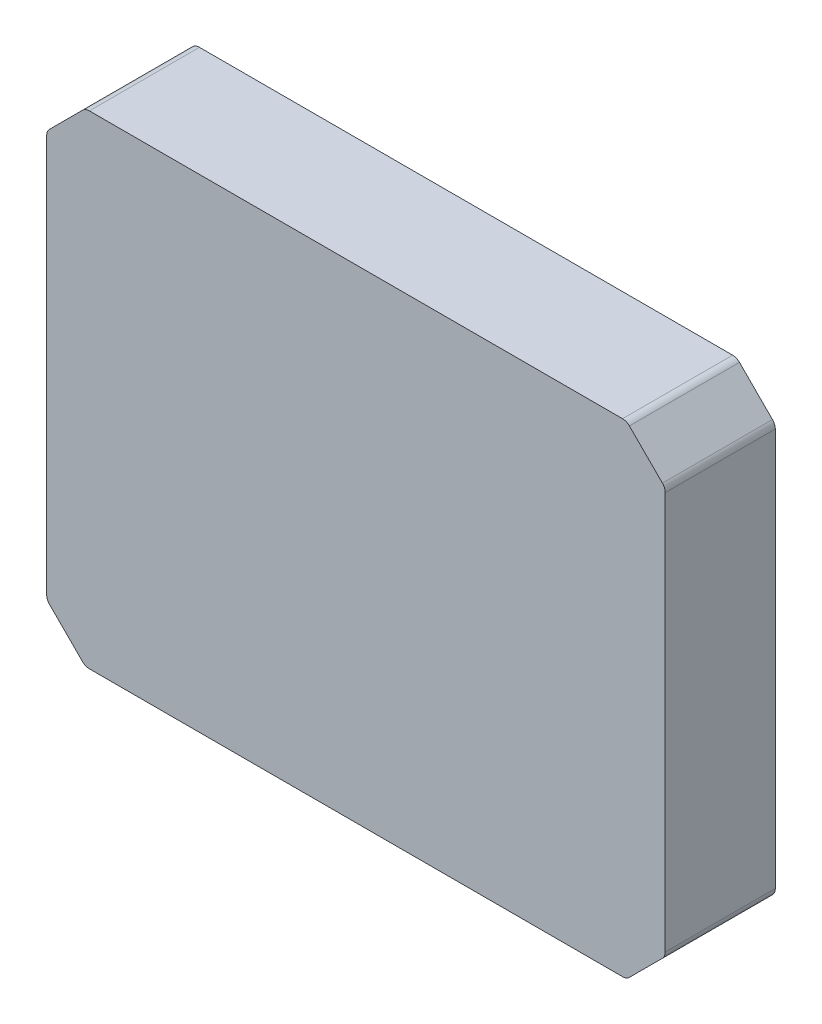
ISO-10303-21;
HEADER;
FILE_DESCRIPTION(('STEP AP214'),'2;1');
FILE_NAME('part.step','',(''),(''),'','','');
FILE_SCHEMA(('AUTOMOTIVE_DESIGN { 1 0 10303 214 1 1 1 1 }'));
ENDSEC;
DATA;
#1=APPLICATION_CONTEXT('core data for automotive mechanical design processes');
#2=APPLICATION_PROTOCOL_DEFINITION('international standard','automotive_design',2000,#1);
#3=PRODUCT_CONTEXT('',#1,'mechanical');
#4=PRODUCT('Part','Part','',(#3));
#5=PRODUCT_RELATED_PRODUCT_CATEGORY('part','',(#4));
#6=PRODUCT_DEFINITION_FORMATION('','',#4);
#7=PRODUCT_DEFINITION_CONTEXT('part definition',#1,'design');
#8=PRODUCT_DEFINITION('design','',#6,#7);
#9=PRODUCT_DEFINITION_SHAPE('','',#8);
#10=(LENGTH_UNIT() NAMED_UNIT(*) SI_UNIT(.MILLI.,.METRE.));
#11=(NAMED_UNIT(*) PLANE_ANGLE_UNIT() SI_UNIT($,.RADIAN.));
#12=(NAMED_UNIT(*) SI_UNIT($,.STERADIAN.) SOLID_ANGLE_UNIT());
#13=UNCERTAINTY_MEASURE_WITH_UNIT(LENGTH_MEASURE(1.E-05),#10,'distance_accuracy_value','');
#14=(GEOMETRIC_REPRESENTATION_CONTEXT(3) GLOBAL_UNCERTAINTY_ASSIGNED_CONTEXT((#13)) GLOBAL_UNIT_ASSIGNED_CONTEXT((#10,
#11,#12)) REPRESENTATION_CONTEXT('',''));
#15=CARTESIAN_POINT('',(0.,0.,0.));
#16=DIRECTION('',(0.,0.,1.));
#17=DIRECTION('',(1.,0.,0.));
#18=AXIS2_PLACEMENT_3D('',#15,#16,#17);
#19=CARTESIAN_POINT('',(1.55,1.029289321881,0.));
#20=DIRECTION('',(0.,0.,-1.));
#21=DIRECTION('',(0.923879532511277,0.382683432365114,0.));
#22=AXIS2_PLACEMENT_3D('',#19,#20,#21);
#23=CYLINDRICAL_SURFACE('',#22,0.05);
#24=CARTESIAN_POINT('',(1.55,1.029289321881,0.002));
#25=DIRECTION('',(0.,0.,1.));
#26=DIRECTION('',(0.923879532511277,0.382683432365114,0.));
#27=AXIS2_PLACEMENT_3D('',#24,#25,#26);
#28=CIRCLE('',#27,0.05);
#29=CARTESIAN_POINT('',(1.6,1.029289321881,0.002));
#30=VERTEX_POINT('',#29);
#31=CARTESIAN_POINT('',(1.585355339059,1.064644660941,0.002));
#32=VERTEX_POINT('',#31);
#33=EDGE_CURVE('E201',#30,#32,#28,.T.);
#34=ORIENTED_EDGE('',*,*,#33,.T.);
#35=DIRECTION('',(0.,0.,1.));
#36=VECTOR('',#35,1.);
#37=CARTESIAN_POINT('',(1.585355339059,1.064644660941,0.));
#38=LINE('',#37,#36);
#39=CARTESIAN_POINT('',(1.585355339059,1.064644660941,0.5715));
#40=VERTEX_POINT('',#39);
#41=EDGE_CURVE('E298',#32,#40,#38,.T.);
#42=ORIENTED_EDGE('',*,*,#41,.T.);
#43=CARTESIAN_POINT('',(1.55,1.029289321881,0.5715));
#44=DIRECTION('',(0.,0.,-1.));
#45=DIRECTION('',(-1.,0.,0.));
#46=AXIS2_PLACEMENT_3D('',#43,#44,#45);
#47=CIRCLE('',#46,0.05);
#48=CARTESIAN_POINT('',(1.6,1.029289321881,0.5715));
#49=VERTEX_POINT('',#48);
#50=EDGE_CURVE('E200',#40,#49,#47,.T.);
#51=ORIENTED_EDGE('',*,*,#50,.T.);
#52=DIRECTION('',(0.,0.,-1.));
#53=VECTOR('',#52,1.);
#54=CARTESIAN_POINT('',(1.6,1.029289321881,0.));
#55=LINE('',#54,#53);
#56=EDGE_CURVE('E175',#49,#30,#55,.T.);
#57=ORIENTED_EDGE('',*,*,#56,.T.);
#58=EDGE_LOOP('',(#34,#42,#51,#57));
#59=FACE_BOUND('',#58,.T.);
#60=ADVANCED_FACE('F17',(#59),#23,.T.);
#61=CARTESIAN_POINT('',(1.5,-1.15,0.));
#62=DIRECTION('',(0.707106781186548,-0.707106781186548,0.));
#63=DIRECTION('',(0.,0.,-1.));
#64=AXIS2_PLACEMENT_3D('',#61,#62,#63);
#65=PLANE('',#64);
#66=DIRECTION('',(0.707106781186548,0.707106781186548,0.));
#67=VECTOR('',#66,1.);
#68=CARTESIAN_POINT('',(1.4125,-1.2375,0.002));
#69=LINE('',#68,#67);
#70=CARTESIAN_POINT('',(1.414644660941,-1.235355339059,0.002));
#71=VERTEX_POINT('',#70);
#72=CARTESIAN_POINT('',(1.585355339059,-1.064644660941,0.002));
#73=VERTEX_POINT('',#72);
#74=EDGE_CURVE('E170',#71,#73,#69,.T.);
#75=ORIENTED_EDGE('',*,*,#74,.T.);
#76=DIRECTION('',(0.,0.,-1.));
#77=VECTOR('',#76,1.);
#78=CARTESIAN_POINT('',(1.585355339059,-1.064644660941,0.));
#79=LINE('',#78,#77);
#80=CARTESIAN_POINT('',(1.585355339059,-1.064644660941,0.5715));
#81=VERTEX_POINT('',#80);
#82=EDGE_CURVE('E164',#81,#73,#79,.T.);
#83=ORIENTED_EDGE('',*,*,#82,.F.);
#84=DIRECTION('',(-0.707106781186548,-0.707106781186548,0.));
#85=VECTOR('',#84,1.);
#86=CARTESIAN_POINT('',(1.36982233047,-1.28017766953,0.5715));
#87=LINE('',#86,#85);
#88=CARTESIAN_POINT('',(1.414644660941,-1.235355339059,0.5715));
#89=VERTEX_POINT('',#88);
#90=EDGE_CURVE('E168',#81,#89,#87,.T.);
#91=ORIENTED_EDGE('',*,*,#90,.T.);
#92=DIRECTION('',(0.,0.,1.));
#93=VECTOR('',#92,1.);
#94=CARTESIAN_POINT('',(1.414644660941,-1.235355339059,0.));
#95=LINE('',#94,#93);
#96=EDGE_CURVE('E11',#71,#89,#95,.T.);
#97=ORIENTED_EDGE('',*,*,#96,.F.);
#98=EDGE_LOOP('',(#75,#83,#91,#97));
#99=FACE_BOUND('',#98,.T.);
#100=ADVANCED_FACE('F166',(#99),#65,.T.);
#101=CARTESIAN_POINT('',(1.379289321881,-1.2,0.));
#102=DIRECTION('',(0.,0.,-1.));
#103=DIRECTION('',(0.382683432365114,-0.923879532511277,0.));
#104=AXIS2_PLACEMENT_3D('',#101,#102,#103);
#105=CYLINDRICAL_SURFACE('',#104,0.05);
#106=CARTESIAN_POINT('',(1.379289321881,-1.2,0.002));
#107=DIRECTION('',(0.,0.,1.));
#108=DIRECTION('',(0.382683432365114,-0.923879532511277,0.));
#109=AXIS2_PLACEMENT_3D('',#106,#107,#108);
#110=CIRCLE('',#109,0.05);
#111=CARTESIAN_POINT('',(1.379289321881,-1.25,0.002));
#112=VERTEX_POINT('',#111);
#113=EDGE_CURVE('E332',#112,#71,#110,.T.);
#114=ORIENTED_EDGE('',*,*,#113,.T.);
#115=ORIENTED_EDGE('',*,*,#96,.T.);
#116=CARTESIAN_POINT('',(1.379289321881,-1.2,0.5715));
#117=DIRECTION('',(0.,0.,-1.));
#118=DIRECTION('',(0.,1.,0.));
#119=AXIS2_PLACEMENT_3D('',#116,#117,#118);
#120=CIRCLE('',#119,0.05);
#121=CARTESIAN_POINT('',(1.379289321881,-1.25,0.5715));
#122=VERTEX_POINT('',#121);
#123=EDGE_CURVE('E191',#89,#122,#120,.T.);
#124=ORIENTED_EDGE('',*,*,#123,.T.);
#125=DIRECTION('',(0.,0.,-1.));
#126=VECTOR('',#125,1.);
#127=CARTESIAN_POINT('',(1.379289321881,-1.25,0.));
#128=LINE('',#127,#126);
#129=EDGE_CURVE('E235',#122,#112,#128,.T.);
#130=ORIENTED_EDGE('',*,*,#129,.T.);
#131=EDGE_LOOP('',(#114,#115,#124,#130));
#132=FACE_BOUND('',#131,.T.);
#133=ADVANCED_FACE('F387',(#132),#105,.T.);
#134=CARTESIAN_POINT('',(-1.5,-1.15,0.));
#135=DIRECTION('',(-0.707106781186548,-0.707106781186548,0.));
#136=DIRECTION('',(-0.707106781186548,0.707106781186548,0.));
#137=AXIS2_PLACEMENT_3D('',#134,#135,#136);
#138=PLANE('',#137);
#139=DIRECTION('',(0.707106781186548,-0.707106781186548,0.));
#140=VECTOR('',#139,1.);
#141=CARTESIAN_POINT('',(-1.4125,-1.2375,0.002));
#142=LINE('',#141,#140);
#143=CARTESIAN_POINT('',(-1.585355339059,-1.064644660941,0.002));
#144=VERTEX_POINT('',#143);
#145=CARTESIAN_POINT('',(-1.414644660941,-1.235355339059,0.002));
#146=VERTEX_POINT('',#145);
#147=EDGE_CURVE('E335',#144,#146,#142,.T.);
#148=ORIENTED_EDGE('',*,*,#147,.T.);
#149=DIRECTION('',(0.,0.,-1.));
#150=VECTOR('',#149,1.);
#151=CARTESIAN_POINT('',(-1.414644660941,-1.235355339059,0.));
#152=LINE('',#151,#150);
#153=CARTESIAN_POINT('',(-1.414644660941,-1.235355339059,0.5715));
#154=VERTEX_POINT('',#153);
#155=EDGE_CURVE('E318',#154,#146,#152,.T.);
#156=ORIENTED_EDGE('',*,*,#155,.F.);
#157=DIRECTION('',(-0.707106781186548,0.707106781186548,0.));
#158=VECTOR('',#157,1.);
#159=CARTESIAN_POINT('',(-1.45517766953,-1.19482233047,0.5715));
#160=LINE('',#159,#158);
#161=CARTESIAN_POINT('',(-1.585355339059,-1.064644660941,0.5715));
#162=VERTEX_POINT('',#161);
#163=EDGE_CURVE('E234',#154,#162,#160,.T.);
#164=ORIENTED_EDGE('',*,*,#163,.T.);
#165=DIRECTION('',(0.,0.,1.));
#166=VECTOR('',#165,1.);
#167=CARTESIAN_POINT('',(-1.585355339059,-1.064644660941,0.4715));
#168=LINE('',#167,#166);
#169=EDGE_CURVE('E37',#144,#162,#168,.T.);
#170=ORIENTED_EDGE('',*,*,#169,.F.);
#171=EDGE_LOOP('',(#148,#156,#164,#170));
#172=FACE_BOUND('',#171,.T.);
#173=ADVANCED_FACE('F378',(#172),#138,.T.);
#174=CARTESIAN_POINT('',(-1.379289321881,1.2,0.));
#175=DIRECTION('',(0.,0.,-1.));
#176=DIRECTION('',(-0.382683432365114,0.923879532511277,0.));
#177=AXIS2_PLACEMENT_3D('',#174,#175,#176);
#178=CYLINDRICAL_SURFACE('',#177,0.05);
#179=CARTESIAN_POINT('',(-1.379289321881,1.2,0.002));
#180=DIRECTION('',(0.,0.,1.));
#181=DIRECTION('',(-0.382683432365114,0.923879532511277,0.));
#182=AXIS2_PLACEMENT_3D('',#179,#180,#181);
#183=CIRCLE('',#182,0.05);
#184=CARTESIAN_POINT('',(-1.379289321881,1.25,0.002));
#185=VERTEX_POINT('',#184);
#186=CARTESIAN_POINT('',(-1.414644660941,1.235355339059,0.002));
#187=VERTEX_POINT('',#186);
#188=EDGE_CURVE('E205',#185,#187,#183,.T.);
#189=ORIENTED_EDGE('',*,*,#188,.T.);
#190=DIRECTION('',(0.,0.,1.));
#191=VECTOR('',#190,1.);
#192=CARTESIAN_POINT('',(-1.414644660941,1.235355339059,0.4715));
#193=LINE('',#192,#191);
#194=CARTESIAN_POINT('',(-1.414644660941,1.235355339059,0.5715));
#195=VERTEX_POINT('',#194);
#196=EDGE_CURVE('E25',#187,#195,#193,.T.);
#197=ORIENTED_EDGE('',*,*,#196,.T.);
#198=CARTESIAN_POINT('',(-1.379289321881,1.2,0.5715));
#199=DIRECTION('',(0.,0.,-1.));
#200=DIRECTION('',(0.,-1.,0.));
#201=AXIS2_PLACEMENT_3D('',#198,#199,#200);
#202=CIRCLE('',#201,0.05);
#203=CARTESIAN_POINT('',(-1.379289321881,1.25,0.5715));
#204=VERTEX_POINT('',#203);
#205=EDGE_CURVE('E221',#195,#204,#202,.T.);
#206=ORIENTED_EDGE('',*,*,#205,.T.);
#207=DIRECTION('',(0.,0.,-1.));
#208=VECTOR('',#207,1.);
#209=CARTESIAN_POINT('',(-1.379289321881,1.25,0.));
#210=LINE('',#209,#208);
#211=EDGE_CURVE('E307',#204,#185,#210,.T.);
#212=ORIENTED_EDGE('',*,*,#211,.T.);
#213=EDGE_LOOP('',(#189,#197,#206,#212));
#214=FACE_BOUND('',#213,.T.);
#215=ADVANCED_FACE('F350',(#214),#178,.T.);
#216=CARTESIAN_POINT('',(-1.5,1.15,0.));
#217=DIRECTION('',(-0.707106781186548,0.707106781186548,0.));
#218=DIRECTION('',(0.,0.,1.));
#219=AXIS2_PLACEMENT_3D('',#216,#217,#218);
#220=PLANE('',#219);
#221=DIRECTION('',(-0.707106781186548,-0.707106781186548,0.));
#222=VECTOR('',#221,1.);
#223=CARTESIAN_POINT('',(-1.4125,1.2375,0.002));
#224=LINE('',#223,#222);
#225=CARTESIAN_POINT('',(-1.585355339059,1.064644660941,0.002));
#226=VERTEX_POINT('',#225);
#227=EDGE_CURVE('E239',#187,#226,#224,.T.);
#228=ORIENTED_EDGE('',*,*,#227,.T.);
#229=DIRECTION('',(0.,0.,-1.));
#230=VECTOR('',#229,1.);
#231=CARTESIAN_POINT('',(-1.585355339059,1.064644660941,0.));
#232=LINE('',#231,#230);
#233=CARTESIAN_POINT('',(-1.585355339059,1.064644660941,0.5715));
#234=VERTEX_POINT('',#233);
#235=EDGE_CURVE('E278',#234,#226,#232,.T.);
#236=ORIENTED_EDGE('',*,*,#235,.F.);
#237=DIRECTION('',(0.707106781186548,0.707106781186548,0.));
#238=VECTOR('',#237,1.);
#239=CARTESIAN_POINT('',(-1.36982233047,1.28017766953,0.5715));
#240=LINE('',#239,#238);
#241=EDGE_CURVE('E244',#234,#195,#240,.T.);
#242=ORIENTED_EDGE('',*,*,#241,.T.);
#243=ORIENTED_EDGE('',*,*,#196,.F.);
#244=EDGE_LOOP('',(#228,#236,#242,#243));
#245=FACE_BOUND('',#244,.T.);
#246=ADVANCED_FACE('F356',(#245),#220,.T.);
#247=CARTESIAN_POINT('',(-1.55,-1.029289321881,0.));
#248=DIRECTION('',(0.,0.,-1.));
#249=DIRECTION('',(-0.923879532511277,-0.382683432365114,0.));
#250=AXIS2_PLACEMENT_3D('',#247,#248,#249);
#251=CYLINDRICAL_SURFACE('',#250,0.05);
#252=CARTESIAN_POINT('',(-1.55,-1.029289321881,0.002));
#253=DIRECTION('',(0.,0.,1.));
#254=DIRECTION('',(-0.923879532511277,-0.382683432365114,0.));
#255=AXIS2_PLACEMENT_3D('',#252,#253,#254);
#256=CIRCLE('',#255,0.05);
#257=CARTESIAN_POINT('',(-1.6,-1.029289321881,0.002));
#258=VERTEX_POINT('',#257);
#259=EDGE_CURVE('E338',#258,#144,#256,.T.);
#260=ORIENTED_EDGE('',*,*,#259,.T.);
#261=ORIENTED_EDGE('',*,*,#169,.T.);
#262=CARTESIAN_POINT('',(-1.55,-1.029289321881,0.5715));
#263=DIRECTION('',(0.,0.,-1.));
#264=DIRECTION('',(1.,0.,0.));
#265=AXIS2_PLACEMENT_3D('',#262,#263,#264);
#266=CIRCLE('',#265,0.05);
#267=CARTESIAN_POINT('',(-1.6,-1.029289321881,0.5715));
#268=VERTEX_POINT('',#267);
#269=EDGE_CURVE('E229',#162,#268,#266,.T.);
#270=ORIENTED_EDGE('',*,*,#269,.T.);
#271=DIRECTION('',(0.,0.,-1.));
#272=VECTOR('',#271,1.);
#273=CARTESIAN_POINT('',(-1.6,-1.029289321881,0.));
#274=LINE('',#273,#272);
#275=EDGE_CURVE('E286',#268,#258,#274,.T.);
#276=ORIENTED_EDGE('',*,*,#275,.T.);
#277=EDGE_LOOP('',(#260,#261,#270,#276));
#278=FACE_BOUND('',#277,.T.);
#279=ADVANCED_FACE('F376',(#278),#251,.T.);
#280=CARTESIAN_POINT('',(1.6,-1.25,0.));
#281=DIRECTION('',(1.,0.,0.));
#282=DIRECTION('',(0.,1.,0.));
#283=AXIS2_PLACEMENT_3D('',#280,#281,#282);
#284=PLANE('',#283);
#285=DIRECTION('',(0.,1.,0.));
#286=VECTOR('',#285,1.);
#287=CARTESIAN_POINT('',(1.6,-0.625,0.002));
#288=LINE('',#287,#286);
#289=CARTESIAN_POINT('',(1.6,-1.029289321881,0.002));
#290=VERTEX_POINT('',#289);
#291=EDGE_CURVE('E204',#290,#30,#288,.T.);
#292=ORIENTED_EDGE('',*,*,#291,.T.);
#293=ORIENTED_EDGE('',*,*,#56,.F.);
#294=DIRECTION('',(0.,-1.,0.));
#295=VECTOR('',#294,1.);
#296=CARTESIAN_POINT('',(1.6,-0.514644660941,0.5715));
#297=LINE('',#296,#295);
#298=CARTESIAN_POINT('',(1.6,-1.029289321881,0.5715));
#299=VERTEX_POINT('',#298);
#300=EDGE_CURVE('E185',#49,#299,#297,.T.);
#301=ORIENTED_EDGE('',*,*,#300,.T.);
#302=DIRECTION('',(0.,0.,1.));
#303=VECTOR('',#302,1.);
#304=CARTESIAN_POINT('',(1.6,-1.029289321881,0.));
#305=LINE('',#304,#303);
#306=EDGE_CURVE('E176',#290,#299,#305,.T.);
#307=ORIENTED_EDGE('',*,*,#306,.F.);
#308=EDGE_LOOP('',(#292,#293,#301,#307));
#309=FACE_BOUND('',#308,.T.);
#310=ADVANCED_FACE('F391',(#309),#284,.T.);
#311=CARTESIAN_POINT('',(1.55,-1.029289321881,0.));
#312=DIRECTION('',(0.,0.,1.));
#313=DIRECTION('',(0.923879532511277,-0.382683432365114,0.));
#314=AXIS2_PLACEMENT_3D('',#311,#312,#313);
#315=CYLINDRICAL_SURFACE('',#314,0.05);
#316=CARTESIAN_POINT('',(1.55,-1.029289321881,0.002));
#317=DIRECTION('',(0.,0.,1.));
#318=DIRECTION('',(0.923879532511277,-0.382683432365114,0.));
#319=AXIS2_PLACEMENT_3D('',#316,#317,#318);
#320=CIRCLE('',#319,0.05);
#321=EDGE_CURVE('E214',#73,#290,#320,.T.);
#322=ORIENTED_EDGE('',*,*,#321,.T.);
#323=ORIENTED_EDGE('',*,*,#306,.T.);
#324=CARTESIAN_POINT('',(1.55,-1.029289321881,0.5715));
#325=DIRECTION('',(0.,0.,-1.));
#326=DIRECTION('',(-0.707106781186548,0.707106781186548,0.));
#327=AXIS2_PLACEMENT_3D('',#324,#325,#326);
#328=CIRCLE('',#327,0.05);
#329=EDGE_CURVE('E179',#299,#81,#328,.T.);
#330=ORIENTED_EDGE('',*,*,#329,.T.);
#331=ORIENTED_EDGE('',*,*,#82,.T.);
#332=EDGE_LOOP('',(#322,#323,#330,#331));
#333=FACE_BOUND('',#332,.T.);
#334=ADVANCED_FACE('F180',(#333),#315,.T.);
#335=CARTESIAN_POINT('',(0.,0.,0.002));
#336=DIRECTION('',(0.,0.,1.));
#337=DIRECTION('',(1.,0.,0.));
#338=AXIS2_PLACEMENT_3D('',#335,#336,#337);
#339=PLANE('',#338);
#340=DIRECTION('',(0.,-1.,0.));
#341=VECTOR('',#340,1.);
#342=CARTESIAN_POINT('',(-1.6,0.625,0.002));
#343=LINE('',#342,#341);
#344=CARTESIAN_POINT('',(-1.6,1.029289321881,0.002));
#345=VERTEX_POINT('',#344);
#346=EDGE_CURVE('E282',#345,#258,#343,.T.);
#347=ORIENTED_EDGE('',*,*,#346,.F.);
#348=CARTESIAN_POINT('',(-1.55,1.029289321881,0.002));
#349=DIRECTION('',(0.,0.,1.));
#350=DIRECTION('',(-0.923879532511277,0.382683432365114,0.));
#351=AXIS2_PLACEMENT_3D('',#348,#349,#350);
#352=CIRCLE('',#351,0.05);
#353=EDGE_CURVE('E271',#226,#345,#352,.T.);
#354=ORIENTED_EDGE('',*,*,#353,.F.);
#355=ORIENTED_EDGE('',*,*,#227,.F.);
#356=ORIENTED_EDGE('',*,*,#188,.F.);
#357=DIRECTION('',(-1.,0.,0.));
#358=VECTOR('',#357,1.);
#359=CARTESIAN_POINT('',(0.8,1.25,0.002));
#360=LINE('',#359,#358);
#361=CARTESIAN_POINT('',(1.379289321881,1.25,0.002));
#362=VERTEX_POINT('',#361);
#363=EDGE_CURVE('E251',#362,#185,#360,.T.);
#364=ORIENTED_EDGE('',*,*,#363,.F.);
#365=CARTESIAN_POINT('',(1.379289321881,1.2,0.002));
#366=DIRECTION('',(0.,0.,1.));
#367=DIRECTION('',(0.382683432365114,0.923879532511277,0.));
#368=AXIS2_PLACEMENT_3D('',#365,#366,#367);
#369=CIRCLE('',#368,0.05);
#370=CARTESIAN_POINT('',(1.414644660941,1.235355339059,0.002));
#371=VERTEX_POINT('',#370);
#372=EDGE_CURVE('E252',#371,#362,#369,.T.);
#373=ORIENTED_EDGE('',*,*,#372,.F.);
#374=DIRECTION('',(-0.707106781186548,0.707106781186548,0.));
#375=VECTOR('',#374,1.);
#376=CARTESIAN_POINT('',(1.4125,1.2375,0.002));
#377=LINE('',#376,#375);
#378=EDGE_CURVE('E290',#32,#371,#377,.T.);
#379=ORIENTED_EDGE('',*,*,#378,.F.);
#380=ORIENTED_EDGE('',*,*,#33,.F.);
#381=ORIENTED_EDGE('',*,*,#291,.F.);
#382=ORIENTED_EDGE('',*,*,#321,.F.);
#383=ORIENTED_EDGE('',*,*,#74,.F.);
#384=ORIENTED_EDGE('',*,*,#113,.F.);
#385=DIRECTION('',(1.,0.,0.));
#386=VECTOR('',#385,1.);
#387=CARTESIAN_POINT('',(-0.8,-1.25,0.002));
#388=LINE('',#387,#386);
#389=CARTESIAN_POINT('',(-1.379289321881,-1.25,0.002));
#390=VERTEX_POINT('',#389);
#391=EDGE_CURVE('E240',#390,#112,#388,.T.);
#392=ORIENTED_EDGE('',*,*,#391,.F.);
#393=CARTESIAN_POINT('',(-1.379289321881,-1.2,0.002));
#394=DIRECTION('',(0.,0.,1.));
#395=DIRECTION('',(-0.382683432365114,-0.923879532511277,0.));
#396=AXIS2_PLACEMENT_3D('',#393,#394,#395);
#397=CIRCLE('',#396,0.05);
#398=EDGE_CURVE('E311',#146,#390,#397,.T.);
#399=ORIENTED_EDGE('',*,*,#398,.F.);
#400=ORIENTED_EDGE('',*,*,#147,.F.);
#401=ORIENTED_EDGE('',*,*,#259,.F.);
#402=EDGE_LOOP('',(#347,#354,#355,#356,#364,#373,#379,#380,#381,#382,#383,#384,#392,#399,#400,#401));
#403=FACE_BOUND('',#402,.T.);
#404=ADVANCED_FACE('F364',(#403),#339,.F.);
#405=CARTESIAN_POINT('',(-1.6,-1.25,0.));
#406=DIRECTION('',(0.,-1.,0.));
#407=DIRECTION('',(0.,0.,-1.));
#408=AXIS2_PLACEMENT_3D('',#405,#406,#407);
#409=PLANE('',#408);
#410=ORIENTED_EDGE('',*,*,#391,.T.);
#411=ORIENTED_EDGE('',*,*,#129,.F.);
#412=DIRECTION('',(-1.,0.,0.));
#413=VECTOR('',#412,1.);
#414=CARTESIAN_POINT('',(-0.689644660941,-1.25,0.5715));
#415=LINE('',#414,#413);
#416=CARTESIAN_POINT('',(-1.379289321881,-1.25,0.5715));
#417=VERTEX_POINT('',#416);
#418=EDGE_CURVE('E265',#122,#417,#415,.T.);
#419=ORIENTED_EDGE('',*,*,#418,.T.);
#420=DIRECTION('',(0.,0.,1.));
#421=VECTOR('',#420,1.);
#422=CARTESIAN_POINT('',(-1.379289321881,-1.25,0.));
#423=LINE('',#422,#421);
#424=EDGE_CURVE('E315',#390,#417,#423,.T.);
#425=ORIENTED_EDGE('',*,*,#424,.F.);
#426=EDGE_LOOP('',(#410,#411,#419,#425));
#427=FACE_BOUND('',#426,.T.);
#428=ADVANCED_FACE('F385',(#427),#409,.T.);
#429=CARTESIAN_POINT('',(-1.379289321881,-1.2,0.));
#430=DIRECTION('',(0.,0.,1.));
#431=DIRECTION('',(-0.382683432365114,-0.923879532511277,0.));
#432=AXIS2_PLACEMENT_3D('',#429,#430,#431);
#433=CYLINDRICAL_SURFACE('',#432,0.05);
#434=ORIENTED_EDGE('',*,*,#398,.T.);
#435=ORIENTED_EDGE('',*,*,#424,.T.);
#436=CARTESIAN_POINT('',(-1.379289321881,-1.2,0.5715));
#437=DIRECTION('',(0.,0.,-1.));
#438=DIRECTION('',(0.707106781186548,0.707106781186548,0.));
#439=AXIS2_PLACEMENT_3D('',#436,#437,#438);
#440=CIRCLE('',#439,0.05);
#441=EDGE_CURVE('E258',#417,#154,#440,.T.);
#442=ORIENTED_EDGE('',*,*,#441,.T.);
#443=ORIENTED_EDGE('',*,*,#155,.T.);
#444=EDGE_LOOP('',(#434,#435,#442,#443));
#445=FACE_BOUND('',#444,.T.);
#446=ADVANCED_FACE('F381',(#445),#433,.T.);
#447=CARTESIAN_POINT('',(1.6,1.25,0.));
#448=DIRECTION('',(0.,1.,0.));
#449=DIRECTION('',(1.,0.,0.));
#450=AXIS2_PLACEMENT_3D('',#447,#448,#449);
#451=PLANE('',#450);
#452=ORIENTED_EDGE('',*,*,#363,.T.);
#453=ORIENTED_EDGE('',*,*,#211,.F.);
#454=DIRECTION('',(1.,0.,0.));
#455=VECTOR('',#454,1.);
#456=CARTESIAN_POINT('',(0.689644660941,1.25,0.5715));
#457=LINE('',#456,#455);
#458=CARTESIAN_POINT('',(1.379289321881,1.25,0.5715));
#459=VERTEX_POINT('',#458);
#460=EDGE_CURVE('E217',#204,#459,#457,.T.);
#461=ORIENTED_EDGE('',*,*,#460,.T.);
#462=DIRECTION('',(0.,0.,1.));
#463=VECTOR('',#462,1.);
#464=CARTESIAN_POINT('',(1.379289321881,1.25,0.4715));
#465=LINE('',#464,#463);
#466=EDGE_CURVE('E248',#362,#459,#465,.T.);
#467=ORIENTED_EDGE('',*,*,#466,.F.);
#468=EDGE_LOOP('',(#452,#453,#461,#467));
#469=FACE_BOUND('',#468,.T.);
#470=ADVANCED_FACE('F362',(#469),#451,.T.);
#471=CARTESIAN_POINT('',(1.379289321881,1.2,0.));
#472=DIRECTION('',(0.,0.,1.));
#473=DIRECTION('',(0.382683432365114,0.923879532511277,0.));
#474=AXIS2_PLACEMENT_3D('',#471,#472,#473);
#475=CYLINDRICAL_SURFACE('',#474,0.05);
#476=ORIENTED_EDGE('',*,*,#372,.T.);
#477=ORIENTED_EDGE('',*,*,#466,.T.);
#478=CARTESIAN_POINT('',(1.379289321881,1.2,0.5715));
#479=DIRECTION('',(0.,0.,-1.));
#480=DIRECTION('',(-0.707106781186548,-0.707106781186548,0.));
#481=AXIS2_PLACEMENT_3D('',#478,#479,#480);
#482=CIRCLE('',#481,0.05);
#483=CARTESIAN_POINT('',(1.414644660941,1.235355339059,0.5715));
#484=VERTEX_POINT('',#483);
#485=EDGE_CURVE('E213',#459,#484,#482,.T.);
#486=ORIENTED_EDGE('',*,*,#485,.T.);
#487=DIRECTION('',(0.,0.,-1.));
#488=VECTOR('',#487,1.);
#489=CARTESIAN_POINT('',(1.414644660941,1.235355339059,0.));
#490=LINE('',#489,#488);
#491=EDGE_CURVE('E294',#484,#371,#490,.T.);
#492=ORIENTED_EDGE('',*,*,#491,.T.);
#493=EDGE_LOOP('',(#476,#477,#486,#492));
#494=FACE_BOUND('',#493,.T.);
#495=ADVANCED_FACE('F398',(#494),#475,.T.);
#496=CARTESIAN_POINT('',(1.5,1.15,0.));
#497=DIRECTION('',(0.707106781186548,0.707106781186548,0.));
#498=DIRECTION('',(0.,0.,-1.));
#499=AXIS2_PLACEMENT_3D('',#496,#497,#498);
#500=PLANE('',#499);
#501=ORIENTED_EDGE('',*,*,#378,.T.);
#502=ORIENTED_EDGE('',*,*,#491,.F.);
#503=DIRECTION('',(0.707106781186548,-0.707106781186548,0.));
#504=VECTOR('',#503,1.);
#505=CARTESIAN_POINT('',(1.45517766953,1.19482233047,0.5715));
#506=LINE('',#505,#504);
#507=EDGE_CURVE('E209',#484,#40,#506,.T.);
#508=ORIENTED_EDGE('',*,*,#507,.T.);
#509=ORIENTED_EDGE('',*,*,#41,.F.);
#510=EDGE_LOOP('',(#501,#502,#508,#509));
#511=FACE_BOUND('',#510,.T.);
#512=ADVANCED_FACE('F396',(#511),#500,.T.);
#513=CARTESIAN_POINT('',(-1.6,1.25,0.));
#514=DIRECTION('',(-1.,0.,0.));
#515=DIRECTION('',(0.,0.,1.));
#516=AXIS2_PLACEMENT_3D('',#513,#514,#515);
#517=PLANE('',#516);
#518=ORIENTED_EDGE('',*,*,#346,.T.);
#519=ORIENTED_EDGE('',*,*,#275,.F.);
#520=DIRECTION('',(0.,1.,0.));
#521=VECTOR('',#520,1.);
#522=CARTESIAN_POINT('',(-1.6,0.514644660941,0.5715));
#523=LINE('',#522,#521);
#524=CARTESIAN_POINT('',(-1.6,1.029289321881,0.5715));
#525=VERTEX_POINT('',#524);
#526=EDGE_CURVE('E225',#268,#525,#523,.T.);
#527=ORIENTED_EDGE('',*,*,#526,.T.);
#528=DIRECTION('',(0.,0.,1.));
#529=VECTOR('',#528,1.);
#530=CARTESIAN_POINT('',(-1.6,1.029289321881,0.4715));
#531=LINE('',#530,#529);
#532=EDGE_CURVE('E275',#345,#525,#531,.T.);
#533=ORIENTED_EDGE('',*,*,#532,.F.);
#534=EDGE_LOOP('',(#518,#519,#527,#533));
#535=FACE_BOUND('',#534,.T.);
#536=ADVANCED_FACE('F374',(#535),#517,.T.);
#537=CARTESIAN_POINT('',(-1.55,1.029289321881,0.));
#538=DIRECTION('',(0.,0.,1.));
#539=DIRECTION('',(-0.923879532511277,0.382683432365114,0.));
#540=AXIS2_PLACEMENT_3D('',#537,#538,#539);
#541=CYLINDRICAL_SURFACE('',#540,0.05);
#542=ORIENTED_EDGE('',*,*,#353,.T.);
#543=ORIENTED_EDGE('',*,*,#532,.T.);
#544=CARTESIAN_POINT('',(-1.55,1.029289321881,0.5715));
#545=DIRECTION('',(0.,0.,-1.));
#546=DIRECTION('',(0.707106781186548,-0.707106781186548,0.));
#547=AXIS2_PLACEMENT_3D('',#544,#545,#546);
#548=CIRCLE('',#547,0.05);
#549=EDGE_CURVE('E230',#525,#234,#548,.T.);
#550=ORIENTED_EDGE('',*,*,#549,.T.);
#551=ORIENTED_EDGE('',*,*,#235,.T.);
#552=EDGE_LOOP('',(#542,#543,#550,#551));
#553=FACE_BOUND('',#552,.T.);
#554=ADVANCED_FACE('F368',(#553),#541,.T.);
#555=CARTESIAN_POINT('',(0.,0.,0.5715));
#556=DIRECTION('',(0.,0.,1.));
#557=DIRECTION('',(1.,0.,0.));
#558=AXIS2_PLACEMENT_3D('',#555,#556,#557);
#559=PLANE('',#558);
#560=ORIENTED_EDGE('',*,*,#90,.F.);
#561=ORIENTED_EDGE('',*,*,#329,.F.);
#562=ORIENTED_EDGE('',*,*,#300,.F.);
#563=ORIENTED_EDGE('',*,*,#50,.F.);
#564=ORIENTED_EDGE('',*,*,#507,.F.);
#565=ORIENTED_EDGE('',*,*,#485,.F.);
#566=ORIENTED_EDGE('',*,*,#460,.F.);
#567=ORIENTED_EDGE('',*,*,#205,.F.);
#568=ORIENTED_EDGE('',*,*,#241,.F.);
#569=ORIENTED_EDGE('',*,*,#549,.F.);
#570=ORIENTED_EDGE('',*,*,#526,.F.);
#571=ORIENTED_EDGE('',*,*,#269,.F.);
#572=ORIENTED_EDGE('',*,*,#163,.F.);
#573=ORIENTED_EDGE('',*,*,#441,.F.);
#574=ORIENTED_EDGE('',*,*,#418,.F.);
#575=ORIENTED_EDGE('',*,*,#123,.F.);
#576=EDGE_LOOP('',(#560,#561,#562,#563,#564,#565,#566,#567,#568,#569,#570,#571,#572,#573,#574,#575));
#577=FACE_BOUND('',#576,.T.);
#578=ADVANCED_FACE('F188',(#577),#559,.T.);
#579=CLOSED_SHELL('',(#60,#100,#133,#173,#215,#246,#279,#310,#334,#404,#428,#446,#470,#495,#512,
#536,#554,#578));
#580=MANIFOLD_SOLID_BREP('B1',#579);
#581=ADVANCED_BREP_SHAPE_REPRESENTATION('',(#18,#580),#14);
#582=SHAPE_DEFINITION_REPRESENTATION(#9,#581);
ENDSEC;
END-ISO-10303-21;
